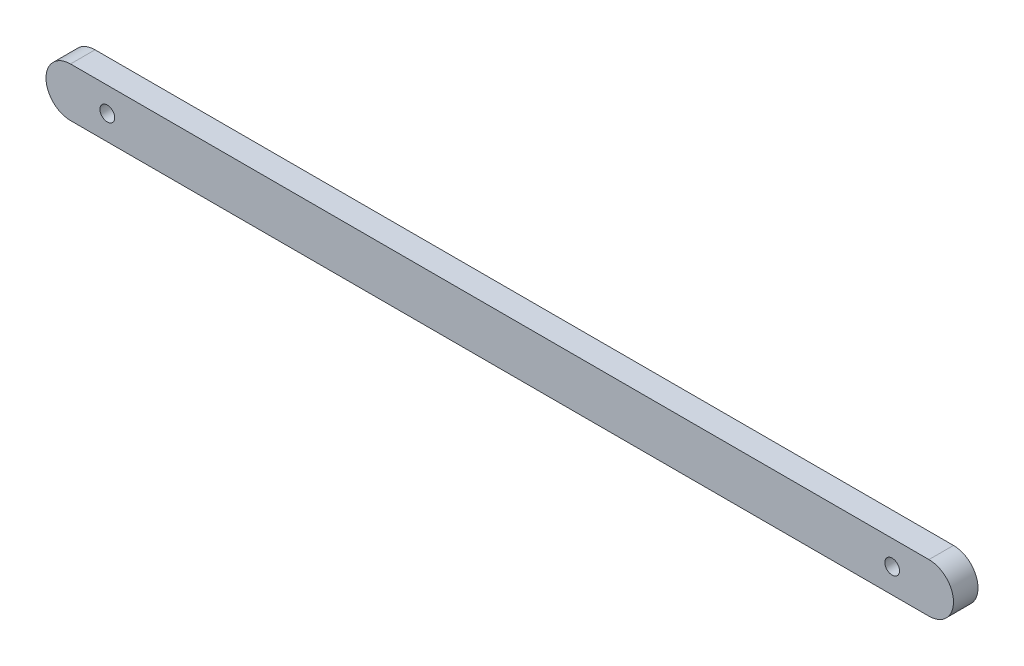
ISO-10303-21;
HEADER;
FILE_DESCRIPTION(('STEP AP214'),'2;1');
FILE_NAME('part.step','',(''),(''),'','','');
FILE_SCHEMA(('AUTOMOTIVE_DESIGN { 1 0 10303 214 1 1 1 1 }'));
ENDSEC;
DATA;
#1=APPLICATION_CONTEXT('core data for automotive mechanical design processes');
#2=APPLICATION_PROTOCOL_DEFINITION('international standard','automotive_design',2000,#1);
#3=PRODUCT_CONTEXT('',#1,'mechanical');
#4=PRODUCT('Part','Part','',(#3));
#5=PRODUCT_RELATED_PRODUCT_CATEGORY('part','',(#4));
#6=PRODUCT_DEFINITION_FORMATION('','',#4);
#7=PRODUCT_DEFINITION_CONTEXT('part definition',#1,'design');
#8=PRODUCT_DEFINITION('design','',#6,#7);
#9=PRODUCT_DEFINITION_SHAPE('','',#8);
#10=(LENGTH_UNIT() NAMED_UNIT(*) SI_UNIT(.MILLI.,.METRE.));
#11=(NAMED_UNIT(*) PLANE_ANGLE_UNIT() SI_UNIT($,.RADIAN.));
#12=(NAMED_UNIT(*) SI_UNIT($,.STERADIAN.) SOLID_ANGLE_UNIT());
#13=UNCERTAINTY_MEASURE_WITH_UNIT(LENGTH_MEASURE(1.E-05),#10,'distance_accuracy_value','');
#14=(GEOMETRIC_REPRESENTATION_CONTEXT(3) GLOBAL_UNCERTAINTY_ASSIGNED_CONTEXT((#13)) GLOBAL_UNIT_ASSIGNED_CONTEXT((#10,
#11,#12)) REPRESENTATION_CONTEXT('',''));
#15=CARTESIAN_POINT('',(0.,0.,0.));
#16=DIRECTION('',(0.,0.,1.));
#17=DIRECTION('',(1.,0.,0.));
#18=AXIS2_PLACEMENT_3D('',#15,#16,#17);
#19=CARTESIAN_POINT('',(-175.,10.,10.));
#20=DIRECTION('',(0.,1.,0.));
#21=DIRECTION('',(-1.,0.,0.));
#22=AXIS2_PLACEMENT_3D('',#19,#20,#21);
#23=PLANE('',#22);
#24=DIRECTION('',(1.,0.,0.));
#25=VECTOR('',#24,1.);
#26=CARTESIAN_POINT('',(-175.,10.,0.));
#27=LINE('',#26,#25);
#28=CARTESIAN_POINT('',(-175.,10.,0.));
#29=VERTEX_POINT('',#28);
#30=CARTESIAN_POINT('',(175.,10.0000000000001,0.));
#31=VERTEX_POINT('',#30);
#32=EDGE_CURVE('E115',#29,#31,#27,.T.);
#33=ORIENTED_EDGE('',*,*,#32,.F.);
#34=DIRECTION('',(0.,0.,-1.));
#35=VECTOR('',#34,1.);
#36=CARTESIAN_POINT('',(-175.,10.,10.));
#37=LINE('',#36,#35);
#38=CARTESIAN_POINT('',(-175.,10.,10.));
#39=VERTEX_POINT('',#38);
#40=EDGE_CURVE('E11',#39,#29,#37,.T.);
#41=ORIENTED_EDGE('',*,*,#40,.F.);
#42=DIRECTION('',(1.,0.,0.));
#43=VECTOR('',#42,1.);
#44=CARTESIAN_POINT('',(-175.,10.,10.));
#45=LINE('',#44,#43);
#46=CARTESIAN_POINT('',(175.,10.0000000000001,10.));
#47=VERTEX_POINT('',#46);
#48=EDGE_CURVE('E107',#39,#47,#45,.T.);
#49=ORIENTED_EDGE('',*,*,#48,.T.);
#50=DIRECTION('',(0.,0.,-1.));
#51=VECTOR('',#50,1.);
#52=CARTESIAN_POINT('',(175.,10.0000000000001,10.));
#53=LINE('',#52,#51);
#54=EDGE_CURVE('E46',#47,#31,#53,.T.);
#55=ORIENTED_EDGE('',*,*,#54,.T.);
#56=EDGE_LOOP('',(#33,#41,#49,#55));
#57=FACE_BOUND('',#56,.T.);
#58=ADVANCED_FACE('F43',(#57),#23,.T.);
#59=CARTESIAN_POINT('',(-175.,0.,10.));
#60=DIRECTION('',(0.,0.,-1.));
#61=DIRECTION('',(-1.,0.,0.));
#62=AXIS2_PLACEMENT_3D('',#59,#60,#61);
#63=CYLINDRICAL_SURFACE('',#62,10.);
#64=CARTESIAN_POINT('',(-175.,0.,0.));
#65=DIRECTION('',(0.,0.,1.));
#66=DIRECTION('',(1.,0.,0.));
#67=AXIS2_PLACEMENT_3D('',#64,#65,#66);
#68=CIRCLE('',#67,10.);
#69=CARTESIAN_POINT('',(-175.,-10.,0.));
#70=VERTEX_POINT('',#69);
#71=EDGE_CURVE('E77',#29,#70,#68,.T.);
#72=ORIENTED_EDGE('',*,*,#71,.T.);
#73=DIRECTION('',(0.,0.,-1.));
#74=VECTOR('',#73,1.);
#75=CARTESIAN_POINT('',(-175.,-10.,10.));
#76=LINE('',#75,#74);
#77=CARTESIAN_POINT('',(-175.,-10.,10.));
#78=VERTEX_POINT('',#77);
#79=EDGE_CURVE('E53',#78,#70,#76,.T.);
#80=ORIENTED_EDGE('',*,*,#79,.F.);
#81=CARTESIAN_POINT('',(-175.,0.,10.));
#82=DIRECTION('',(0.,0.,1.));
#83=DIRECTION('',(1.,0.,0.));
#84=AXIS2_PLACEMENT_3D('',#81,#82,#83);
#85=CIRCLE('',#84,10.);
#86=EDGE_CURVE('E92',#39,#78,#85,.T.);
#87=ORIENTED_EDGE('',*,*,#86,.F.);
#88=ORIENTED_EDGE('',*,*,#40,.T.);
#89=EDGE_LOOP('',(#72,#80,#87,#88));
#90=FACE_BOUND('',#89,.T.);
#91=ADVANCED_FACE('F132',(#90),#63,.T.);
#92=CARTESIAN_POINT('',(-175.,-10.,10.));
#93=DIRECTION('',(0.,1.,0.));
#94=DIRECTION('',(-1.,0.,0.));
#95=AXIS2_PLACEMENT_3D('',#92,#93,#94);
#96=PLANE('',#95);
#97=DIRECTION('',(1.,0.,0.));
#98=VECTOR('',#97,1.);
#99=CARTESIAN_POINT('',(-175.,-10.,0.));
#100=LINE('',#99,#98);
#101=CARTESIAN_POINT('',(175.,-9.99999999999994,0.));
#102=VERTEX_POINT('',#101);
#103=EDGE_CURVE('E100',#70,#102,#100,.T.);
#104=ORIENTED_EDGE('',*,*,#103,.T.);
#105=DIRECTION('',(0.,0.,-1.));
#106=VECTOR('',#105,1.);
#107=CARTESIAN_POINT('',(175.,-9.99999999999994,10.));
#108=LINE('',#107,#106);
#109=CARTESIAN_POINT('',(175.,-9.99999999999994,10.));
#110=VERTEX_POINT('',#109);
#111=EDGE_CURVE('E97',#110,#102,#108,.T.);
#112=ORIENTED_EDGE('',*,*,#111,.F.);
#113=DIRECTION('',(1.,0.,0.));
#114=VECTOR('',#113,1.);
#115=CARTESIAN_POINT('',(-175.,-10.,10.));
#116=LINE('',#115,#114);
#117=EDGE_CURVE('E89',#78,#110,#116,.T.);
#118=ORIENTED_EDGE('',*,*,#117,.F.);
#119=ORIENTED_EDGE('',*,*,#79,.T.);
#120=EDGE_LOOP('',(#104,#112,#118,#119));
#121=FACE_BOUND('',#120,.T.);
#122=ADVANCED_FACE('F98',(#121),#96,.F.);
#123=CARTESIAN_POINT('',(175.,0.,10.));
#124=DIRECTION('',(0.,0.,-1.));
#125=DIRECTION('',(-1.,0.,0.));
#126=AXIS2_PLACEMENT_3D('',#123,#124,#125);
#127=CYLINDRICAL_SURFACE('',#126,10.);
#128=CARTESIAN_POINT('',(175.,0.,0.));
#129=DIRECTION('',(0.,0.,1.));
#130=DIRECTION('',(1.,0.,0.));
#131=AXIS2_PLACEMENT_3D('',#128,#129,#130);
#132=CIRCLE('',#131,10.);
#133=EDGE_CURVE('E119',#102,#31,#132,.T.);
#134=ORIENTED_EDGE('',*,*,#133,.T.);
#135=ORIENTED_EDGE('',*,*,#54,.F.);
#136=CARTESIAN_POINT('',(175.,0.,10.));
#137=DIRECTION('',(0.,0.,1.));
#138=DIRECTION('',(1.,0.,0.));
#139=AXIS2_PLACEMENT_3D('',#136,#137,#138);
#140=CIRCLE('',#139,10.);
#141=EDGE_CURVE('E86',#110,#47,#140,.T.);
#142=ORIENTED_EDGE('',*,*,#141,.F.);
#143=ORIENTED_EDGE('',*,*,#111,.T.);
#144=EDGE_LOOP('',(#134,#135,#142,#143));
#145=FACE_BOUND('',#144,.T.);
#146=ADVANCED_FACE('F105',(#145),#127,.T.);
#147=CARTESIAN_POINT('',(175.,0.,10.));
#148=DIRECTION('',(0.,0.,1.));
#149=DIRECTION('',(1.,0.,0.));
#150=AXIS2_PLACEMENT_3D('',#147,#148,#149);
#151=PLANE('',#150);
#152=CARTESIAN_POINT('',(-160.,0.,10.));
#153=DIRECTION('',(0.,0.,1.));
#154=DIRECTION('',(1.,0.,0.));
#155=AXIS2_PLACEMENT_3D('',#152,#153,#154);
#156=CIRCLE('',#155,2.99999999999999);
#157=CARTESIAN_POINT('',(-157.,0.,10.));
#158=VERTEX_POINT('',#157);
#159=EDGE_CURVE('E168',#158,#158,#156,.T.);
#160=ORIENTED_EDGE('',*,*,#159,.F.);
#161=EDGE_LOOP('',(#160));
#162=FACE_BOUND('',#161,.T.);
#163=CARTESIAN_POINT('',(160.,0.,10.));
#164=DIRECTION('',(0.,0.,1.));
#165=DIRECTION('',(-1.,0.,0.));
#166=AXIS2_PLACEMENT_3D('',#163,#164,#165);
#167=CIRCLE('',#166,2.99999999999999);
#168=CARTESIAN_POINT('',(157.,0.,10.));
#169=VERTEX_POINT('',#168);
#170=EDGE_CURVE('E170',#169,#169,#167,.T.);
#171=ORIENTED_EDGE('',*,*,#170,.F.);
#172=EDGE_LOOP('',(#171));
#173=FACE_BOUND('',#172,.T.);
#174=ORIENTED_EDGE('',*,*,#48,.F.);
#175=ORIENTED_EDGE('',*,*,#86,.T.);
#176=ORIENTED_EDGE('',*,*,#117,.T.);
#177=ORIENTED_EDGE('',*,*,#141,.T.);
#178=EDGE_LOOP('',(#174,#175,#176,#177));
#179=FACE_BOUND('',#178,.T.);
#180=ADVANCED_FACE('F91',(#162,#173,#179),#151,.T.);
#181=CARTESIAN_POINT('',(175.,0.,0.));
#182=DIRECTION('',(0.,0.,1.));
#183=DIRECTION('',(1.,0.,0.));
#184=AXIS2_PLACEMENT_3D('',#181,#182,#183);
#185=PLANE('',#184);
#186=CARTESIAN_POINT('',(-160.,0.,0.));
#187=DIRECTION('',(0.,0.,1.));
#188=DIRECTION('',(1.,0.,0.));
#189=AXIS2_PLACEMENT_3D('',#186,#187,#188);
#190=CIRCLE('',#189,2.99999999999999);
#191=CARTESIAN_POINT('',(-157.,0.,0.));
#192=VERTEX_POINT('',#191);
#193=EDGE_CURVE('E120',#192,#192,#190,.T.);
#194=ORIENTED_EDGE('',*,*,#193,.T.);
#195=EDGE_LOOP('',(#194));
#196=FACE_BOUND('',#195,.T.);
#197=CARTESIAN_POINT('',(160.,0.,0.));
#198=DIRECTION('',(0.,0.,1.));
#199=DIRECTION('',(-1.,0.,0.));
#200=AXIS2_PLACEMENT_3D('',#197,#198,#199);
#201=CIRCLE('',#200,2.99999999999999);
#202=CARTESIAN_POINT('',(157.,0.,0.));
#203=VERTEX_POINT('',#202);
#204=EDGE_CURVE('E176',#203,#203,#201,.T.);
#205=ORIENTED_EDGE('',*,*,#204,.T.);
#206=EDGE_LOOP('',(#205));
#207=FACE_BOUND('',#206,.T.);
#208=ORIENTED_EDGE('',*,*,#32,.T.);
#209=ORIENTED_EDGE('',*,*,#133,.F.);
#210=ORIENTED_EDGE('',*,*,#103,.F.);
#211=ORIENTED_EDGE('',*,*,#71,.F.);
#212=EDGE_LOOP('',(#208,#209,#210,#211));
#213=FACE_BOUND('',#212,.T.);
#214=ADVANCED_FACE('F129',(#196,#207,#213),#185,.F.);
#215=CARTESIAN_POINT('',(160.,0.,0.));
#216=DIRECTION('',(0.,0.,1.));
#217=DIRECTION('',(1.,0.,0.));
#218=AXIS2_PLACEMENT_3D('',#215,#216,#217);
#219=CYLINDRICAL_SURFACE('',#218,2.99999999999999);
#220=ORIENTED_EDGE('',*,*,#204,.F.);
#221=EDGE_LOOP('',(#220));
#222=FACE_BOUND('',#221,.T.);
#223=ORIENTED_EDGE('',*,*,#170,.T.);
#224=EDGE_LOOP('',(#223));
#225=FACE_BOUND('',#224,.T.);
#226=ADVANCED_FACE('F151',(#222,#225),#219,.F.);
#227=CARTESIAN_POINT('',(-160.,0.,0.));
#228=DIRECTION('',(0.,0.,1.));
#229=DIRECTION('',(1.,0.,0.));
#230=AXIS2_PLACEMENT_3D('',#227,#228,#229);
#231=CYLINDRICAL_SURFACE('',#230,2.99999999999999);
#232=ORIENTED_EDGE('',*,*,#193,.F.);
#233=EDGE_LOOP('',(#232));
#234=FACE_BOUND('',#233,.T.);
#235=ORIENTED_EDGE('',*,*,#159,.T.);
#236=EDGE_LOOP('',(#235));
#237=FACE_BOUND('',#236,.T.);
#238=ADVANCED_FACE('F158',(#234,#237),#231,.F.);
#239=CLOSED_SHELL('',(#58,#91,#122,#146,#180,#214,#226,#238));
#240=MANIFOLD_SOLID_BREP('B2',#239);
#241=ADVANCED_BREP_SHAPE_REPRESENTATION('',(#18,#240),#14);
#242=SHAPE_DEFINITION_REPRESENTATION(#9,#241);
ENDSEC;
END-ISO-10303-21;
